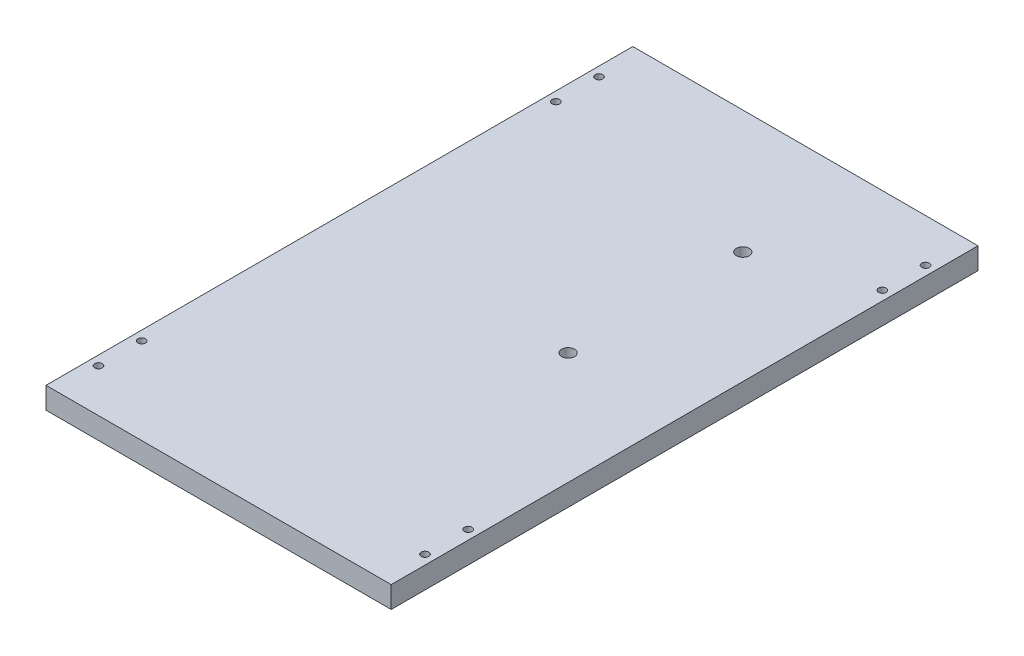
ISO-10303-21;
HEADER;
FILE_DESCRIPTION(('STEP AP214'),'2;1');
FILE_NAME('part.step','',(''),(''),'','','');
FILE_SCHEMA(('AUTOMOTIVE_DESIGN { 1 0 10303 214 1 1 1 1 }'));
ENDSEC;
DATA;
#1=APPLICATION_CONTEXT('core data for automotive mechanical design processes');
#2=APPLICATION_PROTOCOL_DEFINITION('international standard','automotive_design',2000,#1);
#3=PRODUCT_CONTEXT('',#1,'mechanical');
#4=PRODUCT('Part','Part','',(#3));
#5=PRODUCT_RELATED_PRODUCT_CATEGORY('part','',(#4));
#6=PRODUCT_DEFINITION_FORMATION('','',#4);
#7=PRODUCT_DEFINITION_CONTEXT('part definition',#1,'design');
#8=PRODUCT_DEFINITION('design','',#6,#7);
#9=PRODUCT_DEFINITION_SHAPE('','',#8);
#10=(LENGTH_UNIT() NAMED_UNIT(*) SI_UNIT(.MILLI.,.METRE.));
#11=(NAMED_UNIT(*) PLANE_ANGLE_UNIT() SI_UNIT($,.RADIAN.));
#12=(NAMED_UNIT(*) SI_UNIT($,.STERADIAN.) SOLID_ANGLE_UNIT());
#13=UNCERTAINTY_MEASURE_WITH_UNIT(LENGTH_MEASURE(1.E-05),#10,'distance_accuracy_value','');
#14=(GEOMETRIC_REPRESENTATION_CONTEXT(3) GLOBAL_UNCERTAINTY_ASSIGNED_CONTEXT((#13)) GLOBAL_UNIT_ASSIGNED_CONTEXT((#10,
#11,#12)) REPRESENTATION_CONTEXT('',''));
#15=CARTESIAN_POINT('',(0.,0.,0.));
#16=DIRECTION('',(0.,0.,1.));
#17=DIRECTION('',(1.,0.,0.));
#18=AXIS2_PLACEMENT_3D('',#15,#16,#17);
#19=CARTESIAN_POINT('',(0.,10.,0.));
#20=DIRECTION('',(0.,-1.,0.));
#21=DIRECTION('',(0.,0.,-1.));
#22=AXIS2_PLACEMENT_3D('',#19,#20,#21);
#23=PLANE('',#22);
#24=CARTESIAN_POINT('',(108.,10.,-134.));
#25=DIRECTION('',(0.,1.,0.));
#26=DIRECTION('',(0.,0.,1.));
#27=AXIS2_PLACEMENT_3D('',#24,#25,#26);
#28=CIRCLE('',#27,3.00000000000001);
#29=CARTESIAN_POINT('',(108.,10.,-131.));
#30=VERTEX_POINT('',#29);
#31=EDGE_CURVE('E113',#30,#30,#28,.T.);
#32=ORIENTED_EDGE('',*,*,#31,.F.);
#33=EDGE_LOOP('',(#32));
#34=FACE_BOUND('',#33,.T.);
#35=CARTESIAN_POINT('',(108.,10.,-215.));
#36=DIRECTION('',(0.,1.,0.));
#37=DIRECTION('',(0.,0.,1.));
#38=AXIS2_PLACEMENT_3D('',#35,#36,#37);
#39=CIRCLE('',#38,3.00000000000001);
#40=CARTESIAN_POINT('',(108.,10.,-212.));
#41=VERTEX_POINT('',#40);
#42=EDGE_CURVE('E119',#41,#41,#39,.T.);
#43=ORIENTED_EDGE('',*,*,#42,.F.);
#44=EDGE_LOOP('',(#43));
#45=FACE_BOUND('',#44,.T.);
#46=DIRECTION('',(0.,0.,1.));
#47=VECTOR('',#46,1.);
#48=CARTESIAN_POINT('',(0.,10.,0.));
#49=LINE('',#48,#47);
#50=CARTESIAN_POINT('',(0.,10.,-272.));
#51=VERTEX_POINT('',#50);
#52=CARTESIAN_POINT('',(0.,10.,0.));
#53=VERTEX_POINT('',#52);
#54=EDGE_CURVE('E90',#51,#53,#49,.T.);
#55=ORIENTED_EDGE('',*,*,#54,.T.);
#56=DIRECTION('',(1.,0.,0.));
#57=VECTOR('',#56,1.);
#58=CARTESIAN_POINT('',(0.,10.,0.));
#59=LINE('',#58,#57);
#60=CARTESIAN_POINT('',(160.,10.,0.));
#61=VERTEX_POINT('',#60);
#62=EDGE_CURVE('E85',#53,#61,#59,.T.);
#63=ORIENTED_EDGE('',*,*,#62,.T.);
#64=DIRECTION('',(0.,0.,-1.));
#65=VECTOR('',#64,1.);
#66=CARTESIAN_POINT('',(160.,10.,0.));
#67=LINE('',#66,#65);
#68=CARTESIAN_POINT('',(160.,10.,-272.));
#69=VERTEX_POINT('',#68);
#70=EDGE_CURVE('E88',#61,#69,#67,.T.);
#71=ORIENTED_EDGE('',*,*,#70,.T.);
#72=DIRECTION('',(-1.,0.,0.));
#73=VECTOR('',#72,1.);
#74=CARTESIAN_POINT('',(0.,10.,-272.));
#75=LINE('',#74,#73);
#76=EDGE_CURVE('E55',#69,#51,#75,.T.);
#77=ORIENTED_EDGE('',*,*,#76,.T.);
#78=EDGE_LOOP('',(#55,#63,#71,#77));
#79=FACE_BOUND('',#78,.T.);
#80=CARTESIAN_POINT('',(4.3284036956114,10.,-232.));
#81=DIRECTION('',(0.,1.,0.));
#82=DIRECTION('',(0.,0.,1.));
#83=AXIS2_PLACEMENT_3D('',#80,#81,#82);
#84=CIRCLE('',#83,1.75);
#85=CARTESIAN_POINT('',(4.3284036956114,10.,-230.25));
#86=VERTEX_POINT('',#85);
#87=EDGE_CURVE('E106',#86,#86,#84,.T.);
#88=ORIENTED_EDGE('',*,*,#87,.F.);
#89=EDGE_LOOP('',(#88));
#90=FACE_BOUND('',#89,.T.);
#91=CARTESIAN_POINT('',(4.3284036956114,10.,-252.));
#92=DIRECTION('',(0.,1.,0.));
#93=DIRECTION('',(0.,0.,1.));
#94=AXIS2_PLACEMENT_3D('',#91,#92,#93);
#95=CIRCLE('',#94,1.75);
#96=CARTESIAN_POINT('',(4.3284036956114,10.,-250.25));
#97=VERTEX_POINT('',#96);
#98=EDGE_CURVE('E162',#97,#97,#95,.T.);
#99=ORIENTED_EDGE('',*,*,#98,.F.);
#100=EDGE_LOOP('',(#99));
#101=FACE_BOUND('',#100,.T.);
#102=CARTESIAN_POINT('',(155.671596304389,10.,-20.));
#103=DIRECTION('',(0.,1.,0.));
#104=DIRECTION('',(0.,0.,1.));
#105=AXIS2_PLACEMENT_3D('',#102,#103,#104);
#106=CIRCLE('',#105,1.75000000000004);
#107=CARTESIAN_POINT('',(155.671596304389,10.,-18.25));
#108=VERTEX_POINT('',#107);
#109=EDGE_CURVE('E156',#108,#108,#106,.T.);
#110=ORIENTED_EDGE('',*,*,#109,.F.);
#111=EDGE_LOOP('',(#110));
#112=FACE_BOUND('',#111,.T.);
#113=CARTESIAN_POINT('',(155.671596304389,10.,-40.));
#114=DIRECTION('',(0.,1.,0.));
#115=DIRECTION('',(0.,0.,1.));
#116=AXIS2_PLACEMENT_3D('',#113,#114,#115);
#117=CIRCLE('',#116,1.75000000000004);
#118=CARTESIAN_POINT('',(155.671596304389,10.,-38.25));
#119=VERTEX_POINT('',#118);
#120=EDGE_CURVE('E150',#119,#119,#117,.T.);
#121=ORIENTED_EDGE('',*,*,#120,.F.);
#122=EDGE_LOOP('',(#121));
#123=FACE_BOUND('',#122,.T.);
#124=CARTESIAN_POINT('',(155.671596304389,10.,-232.));
#125=DIRECTION('',(0.,1.,0.));
#126=DIRECTION('',(0.,0.,-1.));
#127=AXIS2_PLACEMENT_3D('',#124,#125,#126);
#128=CIRCLE('',#127,1.75000000000004);
#129=CARTESIAN_POINT('',(155.671596304389,10.,-233.75));
#130=VERTEX_POINT('',#129);
#131=EDGE_CURVE('E144',#130,#130,#128,.T.);
#132=ORIENTED_EDGE('',*,*,#131,.F.);
#133=EDGE_LOOP('',(#132));
#134=FACE_BOUND('',#133,.T.);
#135=CARTESIAN_POINT('',(155.671596304389,10.,-252.));
#136=DIRECTION('',(0.,1.,0.));
#137=DIRECTION('',(0.,0.,-1.));
#138=AXIS2_PLACEMENT_3D('',#135,#136,#137);
#139=CIRCLE('',#138,1.75000000000004);
#140=CARTESIAN_POINT('',(155.671596304389,10.,-253.75));
#141=VERTEX_POINT('',#140);
#142=EDGE_CURVE('E138',#141,#141,#139,.T.);
#143=ORIENTED_EDGE('',*,*,#142,.F.);
#144=EDGE_LOOP('',(#143));
#145=FACE_BOUND('',#144,.T.);
#146=CARTESIAN_POINT('',(4.3284036956114,10.,-40.));
#147=DIRECTION('',(0.,1.,0.));
#148=DIRECTION('',(0.,0.,-1.));
#149=AXIS2_PLACEMENT_3D('',#146,#147,#148);
#150=CIRCLE('',#149,1.75);
#151=CARTESIAN_POINT('',(4.3284036956114,10.,-41.75));
#152=VERTEX_POINT('',#151);
#153=EDGE_CURVE('E132',#152,#152,#150,.T.);
#154=ORIENTED_EDGE('',*,*,#153,.F.);
#155=EDGE_LOOP('',(#154));
#156=FACE_BOUND('',#155,.T.);
#157=CARTESIAN_POINT('',(4.3284036956114,10.,-20.));
#158=DIRECTION('',(0.,1.,0.));
#159=DIRECTION('',(0.,0.,-1.));
#160=AXIS2_PLACEMENT_3D('',#157,#158,#159);
#161=CIRCLE('',#160,1.75);
#162=CARTESIAN_POINT('',(4.3284036956114,10.,-21.75));
#163=VERTEX_POINT('',#162);
#164=EDGE_CURVE('E126',#163,#163,#161,.T.);
#165=ORIENTED_EDGE('',*,*,#164,.F.);
#166=EDGE_LOOP('',(#165));
#167=FACE_BOUND('',#166,.T.);
#168=ADVANCED_FACE('F36',(#34,#45,#79,#90,#101,#112,#123,#134,#145,#156,#167),#23,.F.);
#169=CARTESIAN_POINT('',(0.,0.,0.));
#170=DIRECTION('',(0.,-1.,0.));
#171=DIRECTION('',(0.,0.,-1.));
#172=AXIS2_PLACEMENT_3D('',#169,#170,#171);
#173=PLANE('',#172);
#174=CARTESIAN_POINT('',(108.,0.,-134.));
#175=DIRECTION('',(0.,-1.,0.));
#176=DIRECTION('',(0.,0.,-1.));
#177=AXIS2_PLACEMENT_3D('',#174,#175,#176);
#178=CIRCLE('',#177,3.00000000000001);
#179=CARTESIAN_POINT('',(108.,0.,-137.));
#180=VERTEX_POINT('',#179);
#181=EDGE_CURVE('E40',#180,#180,#178,.T.);
#182=ORIENTED_EDGE('',*,*,#181,.F.);
#183=EDGE_LOOP('',(#182));
#184=FACE_BOUND('',#183,.T.);
#185=CARTESIAN_POINT('',(108.,0.,-215.));
#186=DIRECTION('',(0.,-1.,0.));
#187=DIRECTION('',(0.,0.,-1.));
#188=AXIS2_PLACEMENT_3D('',#185,#186,#187);
#189=CIRCLE('',#188,3.00000000000001);
#190=CARTESIAN_POINT('',(108.,0.,-218.));
#191=VERTEX_POINT('',#190);
#192=EDGE_CURVE('E111',#191,#191,#189,.T.);
#193=ORIENTED_EDGE('',*,*,#192,.F.);
#194=EDGE_LOOP('',(#193));
#195=FACE_BOUND('',#194,.T.);
#196=CARTESIAN_POINT('',(4.3284036956114,0.,-40.));
#197=DIRECTION('',(0.,1.,0.));
#198=DIRECTION('',(0.,0.,-1.));
#199=AXIS2_PLACEMENT_3D('',#196,#197,#198);
#200=CIRCLE('',#199,1.75);
#201=CARTESIAN_POINT('',(4.3284036956114,0.,-41.75));
#202=VERTEX_POINT('',#201);
#203=EDGE_CURVE('E129',#202,#202,#200,.T.);
#204=ORIENTED_EDGE('',*,*,#203,.T.);
#205=EDGE_LOOP('',(#204));
#206=FACE_BOUND('',#205,.T.);
#207=CARTESIAN_POINT('',(155.671596304389,0.,-232.));
#208=DIRECTION('',(0.,1.,0.));
#209=DIRECTION('',(0.,0.,-1.));
#210=AXIS2_PLACEMENT_3D('',#207,#208,#209);
#211=CIRCLE('',#210,1.75000000000004);
#212=CARTESIAN_POINT('',(155.671596304389,0.,-233.75));
#213=VERTEX_POINT('',#212);
#214=EDGE_CURVE('E141',#213,#213,#211,.T.);
#215=ORIENTED_EDGE('',*,*,#214,.T.);
#216=EDGE_LOOP('',(#215));
#217=FACE_BOUND('',#216,.T.);
#218=CARTESIAN_POINT('',(155.671596304389,0.,-20.));
#219=DIRECTION('',(0.,1.,0.));
#220=DIRECTION('',(0.,0.,1.));
#221=AXIS2_PLACEMENT_3D('',#218,#219,#220);
#222=CIRCLE('',#221,1.75000000000004);
#223=CARTESIAN_POINT('',(155.671596304389,0.,-18.25));
#224=VERTEX_POINT('',#223);
#225=EDGE_CURVE('E153',#224,#224,#222,.T.);
#226=ORIENTED_EDGE('',*,*,#225,.T.);
#227=EDGE_LOOP('',(#226));
#228=FACE_BOUND('',#227,.T.);
#229=CARTESIAN_POINT('',(4.3284036956114,0.,-232.));
#230=DIRECTION('',(0.,1.,0.));
#231=DIRECTION('',(0.,0.,1.));
#232=AXIS2_PLACEMENT_3D('',#229,#230,#231);
#233=CIRCLE('',#232,1.75);
#234=CARTESIAN_POINT('',(4.3284036956114,0.,-230.25));
#235=VERTEX_POINT('',#234);
#236=EDGE_CURVE('E165',#235,#235,#233,.T.);
#237=ORIENTED_EDGE('',*,*,#236,.T.);
#238=EDGE_LOOP('',(#237));
#239=FACE_BOUND('',#238,.T.);
#240=DIRECTION('',(0.,0.,1.));
#241=VECTOR('',#240,1.);
#242=CARTESIAN_POINT('',(0.,0.,0.));
#243=LINE('',#242,#241);
#244=CARTESIAN_POINT('',(0.,0.,-272.));
#245=VERTEX_POINT('',#244);
#246=CARTESIAN_POINT('',(0.,0.,0.));
#247=VERTEX_POINT('',#246);
#248=EDGE_CURVE('E103',#245,#247,#243,.T.);
#249=ORIENTED_EDGE('',*,*,#248,.F.);
#250=DIRECTION('',(-1.,0.,0.));
#251=VECTOR('',#250,1.);
#252=CARTESIAN_POINT('',(0.,0.,-272.));
#253=LINE('',#252,#251);
#254=CARTESIAN_POINT('',(160.,0.,-272.));
#255=VERTEX_POINT('',#254);
#256=EDGE_CURVE('E78',#255,#245,#253,.T.);
#257=ORIENTED_EDGE('',*,*,#256,.F.);
#258=DIRECTION('',(0.,0.,-1.));
#259=VECTOR('',#258,1.);
#260=CARTESIAN_POINT('',(160.,0.,0.));
#261=LINE('',#260,#259);
#262=CARTESIAN_POINT('',(160.,0.,0.));
#263=VERTEX_POINT('',#262);
#264=EDGE_CURVE('E72',#263,#255,#261,.T.);
#265=ORIENTED_EDGE('',*,*,#264,.F.);
#266=DIRECTION('',(1.,0.,0.));
#267=VECTOR('',#266,1.);
#268=CARTESIAN_POINT('',(0.,0.,0.));
#269=LINE('',#268,#267);
#270=EDGE_CURVE('E94',#247,#263,#269,.T.);
#271=ORIENTED_EDGE('',*,*,#270,.F.);
#272=EDGE_LOOP('',(#249,#257,#265,#271));
#273=FACE_BOUND('',#272,.T.);
#274=CARTESIAN_POINT('',(4.3284036956114,0.,-252.));
#275=DIRECTION('',(0.,1.,0.));
#276=DIRECTION('',(0.,0.,1.));
#277=AXIS2_PLACEMENT_3D('',#274,#275,#276);
#278=CIRCLE('',#277,1.75);
#279=CARTESIAN_POINT('',(4.3284036956114,0.,-250.25));
#280=VERTEX_POINT('',#279);
#281=EDGE_CURVE('E159',#280,#280,#278,.T.);
#282=ORIENTED_EDGE('',*,*,#281,.T.);
#283=EDGE_LOOP('',(#282));
#284=FACE_BOUND('',#283,.T.);
#285=CARTESIAN_POINT('',(155.671596304389,0.,-40.));
#286=DIRECTION('',(0.,1.,0.));
#287=DIRECTION('',(0.,0.,1.));
#288=AXIS2_PLACEMENT_3D('',#285,#286,#287);
#289=CIRCLE('',#288,1.75000000000004);
#290=CARTESIAN_POINT('',(155.671596304389,0.,-38.25));
#291=VERTEX_POINT('',#290);
#292=EDGE_CURVE('E147',#291,#291,#289,.T.);
#293=ORIENTED_EDGE('',*,*,#292,.T.);
#294=EDGE_LOOP('',(#293));
#295=FACE_BOUND('',#294,.T.);
#296=CARTESIAN_POINT('',(155.671596304389,0.,-252.));
#297=DIRECTION('',(0.,1.,0.));
#298=DIRECTION('',(0.,0.,-1.));
#299=AXIS2_PLACEMENT_3D('',#296,#297,#298);
#300=CIRCLE('',#299,1.75000000000004);
#301=CARTESIAN_POINT('',(155.671596304389,0.,-253.75));
#302=VERTEX_POINT('',#301);
#303=EDGE_CURVE('E135',#302,#302,#300,.T.);
#304=ORIENTED_EDGE('',*,*,#303,.T.);
#305=EDGE_LOOP('',(#304));
#306=FACE_BOUND('',#305,.T.);
#307=CARTESIAN_POINT('',(4.3284036956114,0.,-20.));
#308=DIRECTION('',(0.,1.,0.));
#309=DIRECTION('',(0.,0.,-1.));
#310=AXIS2_PLACEMENT_3D('',#307,#308,#309);
#311=CIRCLE('',#310,1.75);
#312=CARTESIAN_POINT('',(4.3284036956114,0.,-21.75));
#313=VERTEX_POINT('',#312);
#314=EDGE_CURVE('E117',#313,#313,#311,.T.);
#315=ORIENTED_EDGE('',*,*,#314,.T.);
#316=EDGE_LOOP('',(#315));
#317=FACE_BOUND('',#316,.T.);
#318=ADVANCED_FACE('F173',(#184,#195,#206,#217,#228,#239,#273,#284,#295,#306,#317),#173,.T.);
#319=CARTESIAN_POINT('',(0.,10.,0.));
#320=DIRECTION('',(1.,0.,0.));
#321=DIRECTION('',(0.,0.,-1.));
#322=AXIS2_PLACEMENT_3D('',#319,#320,#321);
#323=PLANE('',#322);
#324=ORIENTED_EDGE('',*,*,#248,.T.);
#325=DIRECTION('',(0.,-1.,0.));
#326=VECTOR('',#325,1.);
#327=CARTESIAN_POINT('',(0.,10.,0.));
#328=LINE('',#327,#326);
#329=EDGE_CURVE('E11',#53,#247,#328,.T.);
#330=ORIENTED_EDGE('',*,*,#329,.F.);
#331=ORIENTED_EDGE('',*,*,#54,.F.);
#332=DIRECTION('',(0.,-1.,0.));
#333=VECTOR('',#332,1.);
#334=CARTESIAN_POINT('',(0.,10.,-272.));
#335=LINE('',#334,#333);
#336=EDGE_CURVE('E99',#51,#245,#335,.T.);
#337=ORIENTED_EDGE('',*,*,#336,.T.);
#338=EDGE_LOOP('',(#324,#330,#331,#337));
#339=FACE_BOUND('',#338,.T.);
#340=ADVANCED_FACE('F38',(#339),#323,.F.);
#341=CARTESIAN_POINT('',(0.,10.,0.));
#342=DIRECTION('',(0.,0.,-1.));
#343=DIRECTION('',(-1.,0.,0.));
#344=AXIS2_PLACEMENT_3D('',#341,#342,#343);
#345=PLANE('',#344);
#346=ORIENTED_EDGE('',*,*,#270,.T.);
#347=DIRECTION('',(0.,-1.,0.));
#348=VECTOR('',#347,1.);
#349=CARTESIAN_POINT('',(160.,10.,0.));
#350=LINE('',#349,#348);
#351=EDGE_CURVE('E46',#61,#263,#350,.T.);
#352=ORIENTED_EDGE('',*,*,#351,.F.);
#353=ORIENTED_EDGE('',*,*,#62,.F.);
#354=ORIENTED_EDGE('',*,*,#329,.T.);
#355=EDGE_LOOP('',(#346,#352,#353,#354));
#356=FACE_BOUND('',#355,.T.);
#357=ADVANCED_FACE('F93',(#356),#345,.F.);
#358=CARTESIAN_POINT('',(160.,10.,0.));
#359=DIRECTION('',(-1.,0.,0.));
#360=DIRECTION('',(0.,0.,1.));
#361=AXIS2_PLACEMENT_3D('',#358,#359,#360);
#362=PLANE('',#361);
#363=ORIENTED_EDGE('',*,*,#264,.T.);
#364=DIRECTION('',(0.,-1.,0.));
#365=VECTOR('',#364,1.);
#366=CARTESIAN_POINT('',(160.,10.,-272.));
#367=LINE('',#366,#365);
#368=EDGE_CURVE('E95',#69,#255,#367,.T.);
#369=ORIENTED_EDGE('',*,*,#368,.F.);
#370=ORIENTED_EDGE('',*,*,#70,.F.);
#371=ORIENTED_EDGE('',*,*,#351,.T.);
#372=EDGE_LOOP('',(#363,#369,#370,#371));
#373=FACE_BOUND('',#372,.T.);
#374=ADVANCED_FACE('F97',(#373),#362,.F.);
#375=CARTESIAN_POINT('',(0.,10.,-272.));
#376=DIRECTION('',(0.,0.,1.));
#377=DIRECTION('',(1.,0.,0.));
#378=AXIS2_PLACEMENT_3D('',#375,#376,#377);
#379=PLANE('',#378);
#380=ORIENTED_EDGE('',*,*,#256,.T.);
#381=ORIENTED_EDGE('',*,*,#336,.F.);
#382=ORIENTED_EDGE('',*,*,#76,.F.);
#383=ORIENTED_EDGE('',*,*,#368,.T.);
#384=EDGE_LOOP('',(#380,#381,#382,#383));
#385=FACE_BOUND('',#384,.T.);
#386=ADVANCED_FACE('F179',(#385),#379,.F.);
#387=CARTESIAN_POINT('',(4.3284036956114,10.,-232.));
#388=DIRECTION('',(0.,-1.,0.));
#389=DIRECTION('',(0.,0.,-1.));
#390=AXIS2_PLACEMENT_3D('',#387,#388,#389);
#391=CYLINDRICAL_SURFACE('',#390,1.75);
#392=ORIENTED_EDGE('',*,*,#87,.T.);
#393=EDGE_LOOP('',(#392));
#394=FACE_BOUND('',#393,.T.);
#395=ORIENTED_EDGE('',*,*,#236,.F.);
#396=EDGE_LOOP('',(#395));
#397=FACE_BOUND('',#396,.T.);
#398=ADVANCED_FACE('F176',(#394,#397),#391,.F.);
#399=CARTESIAN_POINT('',(4.3284036956114,10.,-252.));
#400=DIRECTION('',(0.,-1.,0.));
#401=DIRECTION('',(0.,0.,-1.));
#402=AXIS2_PLACEMENT_3D('',#399,#400,#401);
#403=CYLINDRICAL_SURFACE('',#402,1.75);
#404=ORIENTED_EDGE('',*,*,#98,.T.);
#405=EDGE_LOOP('',(#404));
#406=FACE_BOUND('',#405,.T.);
#407=ORIENTED_EDGE('',*,*,#281,.F.);
#408=EDGE_LOOP('',(#407));
#409=FACE_BOUND('',#408,.T.);
#410=ADVANCED_FACE('F178',(#406,#409),#403,.F.);
#411=CARTESIAN_POINT('',(155.671596304389,10.,-20.));
#412=DIRECTION('',(0.,-1.,0.));
#413=DIRECTION('',(0.,0.,-1.));
#414=AXIS2_PLACEMENT_3D('',#411,#412,#413);
#415=CYLINDRICAL_SURFACE('',#414,1.75000000000004);
#416=ORIENTED_EDGE('',*,*,#109,.T.);
#417=EDGE_LOOP('',(#416));
#418=FACE_BOUND('',#417,.T.);
#419=ORIENTED_EDGE('',*,*,#225,.F.);
#420=EDGE_LOOP('',(#419));
#421=FACE_BOUND('',#420,.T.);
#422=ADVANCED_FACE('F186',(#418,#421),#415,.F.);
#423=CARTESIAN_POINT('',(155.671596304389,10.,-40.));
#424=DIRECTION('',(0.,-1.,0.));
#425=DIRECTION('',(0.,0.,-1.));
#426=AXIS2_PLACEMENT_3D('',#423,#424,#425);
#427=CYLINDRICAL_SURFACE('',#426,1.75000000000004);
#428=ORIENTED_EDGE('',*,*,#120,.T.);
#429=EDGE_LOOP('',(#428));
#430=FACE_BOUND('',#429,.T.);
#431=ORIENTED_EDGE('',*,*,#292,.F.);
#432=EDGE_LOOP('',(#431));
#433=FACE_BOUND('',#432,.T.);
#434=ADVANCED_FACE('F241',(#430,#433),#427,.F.);
#435=CARTESIAN_POINT('',(155.671596304389,10.,-232.));
#436=DIRECTION('',(0.,-1.,0.));
#437=DIRECTION('',(0.,0.,-1.));
#438=AXIS2_PLACEMENT_3D('',#435,#436,#437);
#439=CYLINDRICAL_SURFACE('',#438,1.75000000000004);
#440=ORIENTED_EDGE('',*,*,#131,.T.);
#441=EDGE_LOOP('',(#440));
#442=FACE_BOUND('',#441,.T.);
#443=ORIENTED_EDGE('',*,*,#214,.F.);
#444=EDGE_LOOP('',(#443));
#445=FACE_BOUND('',#444,.T.);
#446=ADVANCED_FACE('F237',(#442,#445),#439,.F.);
#447=CARTESIAN_POINT('',(155.671596304389,10.,-252.));
#448=DIRECTION('',(0.,-1.,0.));
#449=DIRECTION('',(0.,0.,-1.));
#450=AXIS2_PLACEMENT_3D('',#447,#448,#449);
#451=CYLINDRICAL_SURFACE('',#450,1.75000000000004);
#452=ORIENTED_EDGE('',*,*,#142,.T.);
#453=EDGE_LOOP('',(#452));
#454=FACE_BOUND('',#453,.T.);
#455=ORIENTED_EDGE('',*,*,#303,.F.);
#456=EDGE_LOOP('',(#455));
#457=FACE_BOUND('',#456,.T.);
#458=ADVANCED_FACE('F230',(#454,#457),#451,.F.);
#459=CARTESIAN_POINT('',(4.3284036956114,10.,-40.));
#460=DIRECTION('',(0.,-1.,0.));
#461=DIRECTION('',(0.,0.,-1.));
#462=AXIS2_PLACEMENT_3D('',#459,#460,#461);
#463=CYLINDRICAL_SURFACE('',#462,1.75);
#464=ORIENTED_EDGE('',*,*,#153,.T.);
#465=EDGE_LOOP('',(#464));
#466=FACE_BOUND('',#465,.T.);
#467=ORIENTED_EDGE('',*,*,#203,.F.);
#468=EDGE_LOOP('',(#467));
#469=FACE_BOUND('',#468,.T.);
#470=ADVANCED_FACE('F221',(#466,#469),#463,.F.);
#471=CARTESIAN_POINT('',(4.3284036956114,10.,-20.));
#472=DIRECTION('',(0.,-1.,0.));
#473=DIRECTION('',(0.,0.,-1.));
#474=AXIS2_PLACEMENT_3D('',#471,#472,#473);
#475=CYLINDRICAL_SURFACE('',#474,1.75);
#476=ORIENTED_EDGE('',*,*,#164,.T.);
#477=EDGE_LOOP('',(#476));
#478=FACE_BOUND('',#477,.T.);
#479=ORIENTED_EDGE('',*,*,#314,.F.);
#480=EDGE_LOOP('',(#479));
#481=FACE_BOUND('',#480,.T.);
#482=ADVANCED_FACE('F218',(#478,#481),#475,.F.);
#483=CARTESIAN_POINT('',(108.,-8.,-215.));
#484=DIRECTION('',(0.,1.,0.));
#485=DIRECTION('',(0.,0.,1.));
#486=AXIS2_PLACEMENT_3D('',#483,#484,#485);
#487=CYLINDRICAL_SURFACE('',#486,3.00000000000001);
#488=ORIENTED_EDGE('',*,*,#192,.T.);
#489=EDGE_LOOP('',(#488));
#490=FACE_BOUND('',#489,.T.);
#491=ORIENTED_EDGE('',*,*,#42,.T.);
#492=EDGE_LOOP('',(#491));
#493=FACE_BOUND('',#492,.T.);
#494=ADVANCED_FACE('F220',(#490,#493),#487,.F.);
#495=CARTESIAN_POINT('',(108.,-8.,-134.));
#496=DIRECTION('',(0.,1.,0.));
#497=DIRECTION('',(0.,0.,1.));
#498=AXIS2_PLACEMENT_3D('',#495,#496,#497);
#499=CYLINDRICAL_SURFACE('',#498,3.00000000000001);
#500=ORIENTED_EDGE('',*,*,#181,.T.);
#501=EDGE_LOOP('',(#500));
#502=FACE_BOUND('',#501,.T.);
#503=ORIENTED_EDGE('',*,*,#31,.T.);
#504=EDGE_LOOP('',(#503));
#505=FACE_BOUND('',#504,.T.);
#506=ADVANCED_FACE('F228',(#502,#505),#499,.F.);
#507=CLOSED_SHELL('',(#168,#318,#340,#357,#374,#386,#398,#410,#422,#434,#446,#458,#470,#482,
#494,#506));
#508=MANIFOLD_SOLID_BREP('B2',#507);
#509=ADVANCED_BREP_SHAPE_REPRESENTATION('',(#18,#508),#14);
#510=SHAPE_DEFINITION_REPRESENTATION(#9,#509);
ENDSEC;
END-ISO-10303-21;
